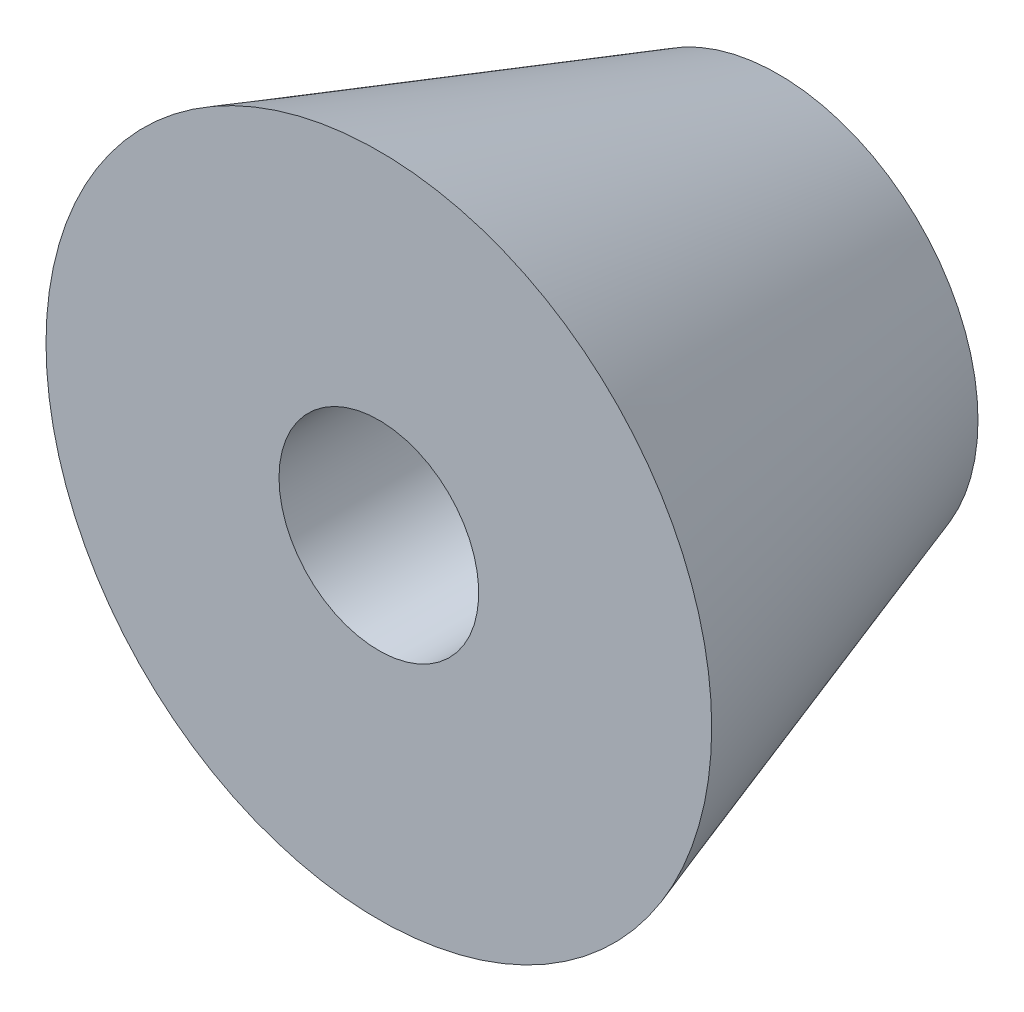
ISO-10303-21;
HEADER;
FILE_DESCRIPTION(('STEP AP214'),'2;1');
FILE_NAME('part.step','',(''),(''),'','','');
FILE_SCHEMA(('AUTOMOTIVE_DESIGN { 1 0 10303 214 1 1 1 1 }'));
ENDSEC;
DATA;
#1=APPLICATION_CONTEXT('core data for automotive mechanical design processes');
#2=APPLICATION_PROTOCOL_DEFINITION('international standard','automotive_design',2000,#1);
#3=PRODUCT_CONTEXT('',#1,'mechanical');
#4=PRODUCT('Part','Part','',(#3));
#5=PRODUCT_RELATED_PRODUCT_CATEGORY('part','',(#4));
#6=PRODUCT_DEFINITION_FORMATION('','',#4);
#7=PRODUCT_DEFINITION_CONTEXT('part definition',#1,'design');
#8=PRODUCT_DEFINITION('design','',#6,#7);
#9=PRODUCT_DEFINITION_SHAPE('','',#8);
#10=(LENGTH_UNIT() NAMED_UNIT(*) SI_UNIT(.MILLI.,.METRE.));
#11=(NAMED_UNIT(*) PLANE_ANGLE_UNIT() SI_UNIT($,.RADIAN.));
#12=(NAMED_UNIT(*) SI_UNIT($,.STERADIAN.) SOLID_ANGLE_UNIT());
#13=UNCERTAINTY_MEASURE_WITH_UNIT(LENGTH_MEASURE(1.E-05),#10,'distance_accuracy_value','');
#14=(GEOMETRIC_REPRESENTATION_CONTEXT(3) GLOBAL_UNCERTAINTY_ASSIGNED_CONTEXT((#13)) GLOBAL_UNIT_ASSIGNED_CONTEXT((#10,
#11,#12)) REPRESENTATION_CONTEXT('',''));
#15=CARTESIAN_POINT('',(0.,0.,0.));
#16=DIRECTION('',(0.,0.,1.));
#17=DIRECTION('',(1.,0.,0.));
#18=AXIS2_PLACEMENT_3D('',#15,#16,#17);
#19=CARTESIAN_POINT('',(0.,0.,-15.6666666666667));
#20=DIRECTION('',(0.,0.,-1.));
#21=DIRECTION('',(-1.,0.,0.));
#22=AXIS2_PLACEMENT_3D('',#19,#20,#21);
#23=CYLINDRICAL_SURFACE('',#22,1.5);
#24=CARTESIAN_POINT('',(0.,0.,6.6888888888889));
#25=DIRECTION('',(0.,0.,-1.));
#26=DIRECTION('',(-1.,0.,0.));
#27=AXIS2_PLACEMENT_3D('',#24,#25,#26);
#28=CIRCLE('',#27,1.5);
#29=CARTESIAN_POINT('',(-1.5,0.,6.6888888888889));
#30=VERTEX_POINT('',#29);
#31=EDGE_CURVE('E53',#30,#30,#28,.T.);
#32=ORIENTED_EDGE('',*,*,#31,.F.);
#33=EDGE_LOOP('',(#32));
#34=FACE_BOUND('',#33,.T.);
#35=CARTESIAN_POINT('',(0.,0.,0.688888888888895));
#36=DIRECTION('',(0.,0.,-1.));
#37=DIRECTION('',(-1.,0.,0.));
#38=AXIS2_PLACEMENT_3D('',#35,#36,#37);
#39=CIRCLE('',#38,1.5);
#40=CARTESIAN_POINT('',(-1.5,0.,0.688888888888895));
#41=VERTEX_POINT('',#40);
#42=EDGE_CURVE('E10',#41,#41,#39,.T.);
#43=ORIENTED_EDGE('',*,*,#42,.T.);
#44=EDGE_LOOP('',(#43));
#45=FACE_BOUND('',#44,.T.);
#46=ADVANCED_FACE('F39',(#34,#45),#23,.F.);
#47=CARTESIAN_POINT('',(0.,0.,0.688888888888895));
#48=DIRECTION('',(0.,0.,1.));
#49=DIRECTION('',(1.,0.,0.));
#50=AXIS2_PLACEMENT_3D('',#47,#48,#49);
#51=PLANE('',#50);
#52=ORIENTED_EDGE('',*,*,#42,.F.);
#53=EDGE_LOOP('',(#52));
#54=FACE_BOUND('',#53,.T.);
#55=CARTESIAN_POINT('',(0.,0.,0.688888888888895));
#56=DIRECTION('',(0.,0.,-1.));
#57=DIRECTION('',(-1.,0.,0.));
#58=AXIS2_PLACEMENT_3D('',#55,#56,#57);
#59=CIRCLE('',#58,3.);
#60=CARTESIAN_POINT('',(-3.,0.,0.688888888888895));
#61=VERTEX_POINT('',#60);
#62=EDGE_CURVE('E45',#61,#61,#59,.T.);
#63=ORIENTED_EDGE('',*,*,#62,.T.);
#64=EDGE_LOOP('',(#63));
#65=FACE_BOUND('',#64,.T.);
#66=ADVANCED_FACE('F62',(#54,#65),#51,.F.);
#67=CARTESIAN_POINT('',(0.,0.,6.6888888888889));
#68=DIRECTION('',(0.,0.,1.));
#69=DIRECTION('',(1.,0.,0.));
#70=AXIS2_PLACEMENT_3D('',#67,#68,#69);
#71=CONICAL_SURFACE('',#70,5.,0.321750554396642);
#72=ORIENTED_EDGE('',*,*,#62,.F.);
#73=EDGE_LOOP('',(#72));
#74=FACE_BOUND('',#73,.T.);
#75=CARTESIAN_POINT('',(0.,0.,6.6888888888889));
#76=DIRECTION('',(0.,0.,-1.));
#77=DIRECTION('',(-1.,0.,0.));
#78=AXIS2_PLACEMENT_3D('',#75,#76,#77);
#79=CIRCLE('',#78,5.);
#80=CARTESIAN_POINT('',(-5.,0.,6.6888888888889));
#81=VERTEX_POINT('',#80);
#82=EDGE_CURVE('E49',#81,#81,#79,.T.);
#83=ORIENTED_EDGE('',*,*,#82,.T.);
#84=EDGE_LOOP('',(#83));
#85=FACE_BOUND('',#84,.T.);
#86=ADVANCED_FACE('F66',(#74,#85),#71,.T.);
#87=CARTESIAN_POINT('',(0.,0.,6.6888888888889));
#88=DIRECTION('',(0.,0.,-1.));
#89=DIRECTION('',(-1.,0.,0.));
#90=AXIS2_PLACEMENT_3D('',#87,#88,#89);
#91=PLANE('',#90);
#92=ORIENTED_EDGE('',*,*,#82,.F.);
#93=EDGE_LOOP('',(#92));
#94=FACE_BOUND('',#93,.T.);
#95=ORIENTED_EDGE('',*,*,#31,.T.);
#96=EDGE_LOOP('',(#95));
#97=FACE_BOUND('',#96,.T.);
#98=ADVANCED_FACE('F59',(#94,#97),#91,.F.);
#99=CLOSED_SHELL('',(#46,#66,#86,#98));
#100=MANIFOLD_SOLID_BREP('B2',#99);
#101=ADVANCED_BREP_SHAPE_REPRESENTATION('',(#18,#100),#14);
#102=SHAPE_DEFINITION_REPRESENTATION(#9,#101);
ENDSEC;
END-ISO-10303-21;
